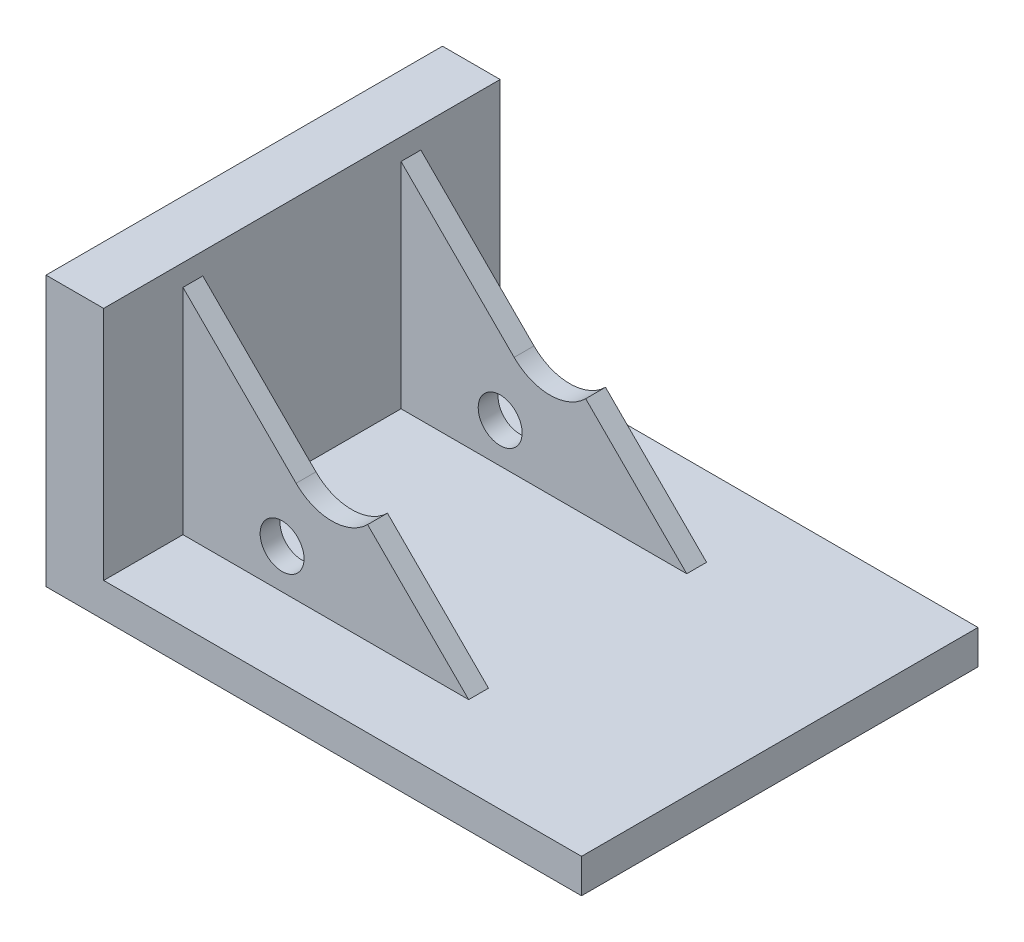
ISO-10303-21;
HEADER;
FILE_DESCRIPTION(('STEP AP214'),'2;1');
FILE_NAME('part.step','',(''),(''),'','','');
FILE_SCHEMA(('AUTOMOTIVE_DESIGN { 1 0 10303 214 1 1 1 1 }'));
ENDSEC;
DATA;
#1=APPLICATION_CONTEXT('core data for automotive mechanical design processes');
#2=APPLICATION_PROTOCOL_DEFINITION('international standard','automotive_design',2000,#1);
#3=PRODUCT_CONTEXT('',#1,'mechanical');
#4=PRODUCT('Part','Part','',(#3));
#5=PRODUCT_RELATED_PRODUCT_CATEGORY('part','',(#4));
#6=PRODUCT_DEFINITION_FORMATION('','',#4);
#7=PRODUCT_DEFINITION_CONTEXT('part definition',#1,'design');
#8=PRODUCT_DEFINITION('design','',#6,#7);
#9=PRODUCT_DEFINITION_SHAPE('','',#8);
#10=(LENGTH_UNIT() NAMED_UNIT(*) SI_UNIT(.MILLI.,.METRE.));
#11=(NAMED_UNIT(*) PLANE_ANGLE_UNIT() SI_UNIT($,.RADIAN.));
#12=(NAMED_UNIT(*) SI_UNIT($,.STERADIAN.) SOLID_ANGLE_UNIT());
#13=UNCERTAINTY_MEASURE_WITH_UNIT(LENGTH_MEASURE(1.E-05),#10,'distance_accuracy_value','');
#14=(GEOMETRIC_REPRESENTATION_CONTEXT(3) GLOBAL_UNCERTAINTY_ASSIGNED_CONTEXT((#13)) GLOBAL_UNIT_ASSIGNED_CONTEXT((#10,
#11,#12)) REPRESENTATION_CONTEXT('',''));
#15=CARTESIAN_POINT('',(0.,0.,0.));
#16=DIRECTION('',(0.,0.,1.));
#17=DIRECTION('',(1.,0.,0.));
#18=AXIS2_PLACEMENT_3D('',#15,#16,#17);
#19=CARTESIAN_POINT('',(-67.3265667328878,68.0538598920394,50.));
#20=DIRECTION('',(1.,0.,0.));
#21=DIRECTION('',(0.,0.,-1.));
#22=AXIS2_PLACEMENT_3D('',#19,#20,#21);
#23=PLANE('',#22);
#24=DIRECTION('',(0.,-1.,0.));
#25=VECTOR('',#24,1.);
#26=CARTESIAN_POINT('',(-67.3265667328878,68.0538598920394,-50.));
#27=LINE('',#26,#25);
#28=CARTESIAN_POINT('',(-67.3265667328878,68.0538598920394,-50.));
#29=VERTEX_POINT('',#28);
#30=CARTESIAN_POINT('',(-67.3265667328878,0.,-50.));
#31=VERTEX_POINT('',#30);
#32=EDGE_CURVE('E225',#29,#31,#27,.T.);
#33=ORIENTED_EDGE('',*,*,#32,.T.);
#34=DIRECTION('',(0.,0.,-1.));
#35=VECTOR('',#34,1.);
#36=CARTESIAN_POINT('',(-67.3265667328878,0.,50.));
#37=LINE('',#36,#35);
#38=CARTESIAN_POINT('',(-67.3265667328878,0.,50.));
#39=VERTEX_POINT('',#38);
#40=EDGE_CURVE('E269',#39,#31,#37,.T.);
#41=ORIENTED_EDGE('',*,*,#40,.F.);
#42=DIRECTION('',(0.,-1.,0.));
#43=VECTOR('',#42,1.);
#44=CARTESIAN_POINT('',(-67.3265667328878,68.0538598920394,50.));
#45=LINE('',#44,#43);
#46=CARTESIAN_POINT('',(-67.3265667328878,68.0538598920394,50.));
#47=VERTEX_POINT('',#46);
#48=EDGE_CURVE('E226',#47,#39,#45,.T.);
#49=ORIENTED_EDGE('',*,*,#48,.F.);
#50=DIRECTION('',(0.,0.,-1.));
#51=VECTOR('',#50,1.);
#52=CARTESIAN_POINT('',(-67.3265667328878,68.0538598920394,50.));
#53=LINE('',#52,#51);
#54=EDGE_CURVE('E240',#47,#29,#53,.T.);
#55=ORIENTED_EDGE('',*,*,#54,.T.);
#56=EDGE_LOOP('',(#33,#41,#49,#55));
#57=FACE_BOUND('',#56,.T.);
#58=ADVANCED_FACE('F37',(#57),#23,.F.);
#59=CARTESIAN_POINT('',(-67.3265667328878,0.,50.));
#60=DIRECTION('',(0.,1.,0.));
#61=DIRECTION('',(0.,0.,1.));
#62=AXIS2_PLACEMENT_3D('',#59,#60,#61);
#63=PLANE('',#62);
#64=ORIENTED_EDGE('',*,*,#40,.T.);
#65=DIRECTION('',(1.,0.,0.));
#66=VECTOR('',#65,1.);
#67=CARTESIAN_POINT('',(-67.3265667328878,0.,-50.));
#68=LINE('',#67,#66);
#69=CARTESIAN_POINT('',(67.7421628238316,0.,-50.));
#70=VERTEX_POINT('',#69);
#71=EDGE_CURVE('E243',#31,#70,#68,.T.);
#72=ORIENTED_EDGE('',*,*,#71,.T.);
#73=DIRECTION('',(0.,0.,-1.));
#74=VECTOR('',#73,1.);
#75=CARTESIAN_POINT('',(67.7421628238316,0.,50.));
#76=LINE('',#75,#74);
#77=CARTESIAN_POINT('',(67.7421628238316,0.,50.));
#78=VERTEX_POINT('',#77);
#79=EDGE_CURVE('E266',#78,#70,#76,.T.);
#80=ORIENTED_EDGE('',*,*,#79,.F.);
#81=DIRECTION('',(1.,0.,0.));
#82=VECTOR('',#81,1.);
#83=CARTESIAN_POINT('',(-67.3265667328878,0.,50.));
#84=LINE('',#83,#82);
#85=EDGE_CURVE('E229',#39,#78,#84,.T.);
#86=ORIENTED_EDGE('',*,*,#85,.F.);
#87=EDGE_LOOP('',(#64,#72,#80,#86));
#88=FACE_BOUND('',#87,.T.);
#89=ADVANCED_FACE('F334',(#88),#63,.F.);
#90=CARTESIAN_POINT('',(67.7421628238316,0.,50.));
#91=DIRECTION('',(-1.,0.,0.));
#92=DIRECTION('',(0.,0.,1.));
#93=AXIS2_PLACEMENT_3D('',#90,#91,#92);
#94=PLANE('',#93);
#95=DIRECTION('',(0.,1.,0.));
#96=VECTOR('',#95,1.);
#97=CARTESIAN_POINT('',(67.7421628238316,0.,-50.));
#98=LINE('',#97,#96);
#99=CARTESIAN_POINT('',(67.7421628238316,8.62361888708285,-50.));
#100=VERTEX_POINT('',#99);
#101=EDGE_CURVE('E245',#70,#100,#98,.T.);
#102=ORIENTED_EDGE('',*,*,#101,.T.);
#103=DIRECTION('',(0.,0.,-1.));
#104=VECTOR('',#103,1.);
#105=CARTESIAN_POINT('',(67.7421628238316,8.62361888708285,50.));
#106=LINE('',#105,#104);
#107=CARTESIAN_POINT('',(67.7421628238316,8.62361888708285,50.));
#108=VERTEX_POINT('',#107);
#109=EDGE_CURVE('E262',#108,#100,#106,.T.);
#110=ORIENTED_EDGE('',*,*,#109,.F.);
#111=DIRECTION('',(0.,1.,0.));
#112=VECTOR('',#111,1.);
#113=CARTESIAN_POINT('',(67.7421628238316,0.,50.));
#114=LINE('',#113,#112);
#115=EDGE_CURVE('E232',#78,#108,#114,.T.);
#116=ORIENTED_EDGE('',*,*,#115,.F.);
#117=ORIENTED_EDGE('',*,*,#79,.T.);
#118=EDGE_LOOP('',(#102,#110,#116,#117));
#119=FACE_BOUND('',#118,.T.);
#120=ADVANCED_FACE('F306',(#119),#94,.F.);
#121=CARTESIAN_POINT('',(67.7421628238316,8.62361888708285,50.));
#122=DIRECTION('',(0.,-1.,0.));
#123=DIRECTION('',(0.,0.,-1.));
#124=AXIS2_PLACEMENT_3D('',#121,#122,#123);
#125=PLANE('',#124);
#126=DIRECTION('',(0.,0.,-1.));
#127=VECTOR('',#126,1.);
#128=CARTESIAN_POINT('',(-52.7807035498565,8.62361888708285,50.));
#129=LINE('',#128,#127);
#130=CARTESIAN_POINT('',(-52.7807035498565,8.62361888708285,-30.));
#131=VERTEX_POINT('',#130);
#132=CARTESIAN_POINT('',(-52.7807035498565,8.62361888708285,-50.));
#133=VERTEX_POINT('',#132);
#134=EDGE_CURVE('E258',#131,#133,#129,.T.);
#135=ORIENTED_EDGE('',*,*,#134,.F.);
#136=DIRECTION('',(1.,0.,0.));
#137=VECTOR('',#136,1.);
#138=CARTESIAN_POINT('',(67.7421628238316,8.62361888708285,-30.));
#139=LINE('',#138,#137);
#140=CARTESIAN_POINT('',(19.2795506542954,8.62361888708285,-30.));
#141=VERTEX_POINT('',#140);
#142=EDGE_CURVE('E50',#131,#141,#139,.T.);
#143=ORIENTED_EDGE('',*,*,#142,.T.);
#144=DIRECTION('',(0.,0.,1.));
#145=VECTOR('',#144,1.);
#146=CARTESIAN_POINT('',(19.2795506542954,8.62361888708285,50.));
#147=LINE('',#146,#145);
#148=CARTESIAN_POINT('',(19.2795506542954,8.62361888708285,-25.));
#149=VERTEX_POINT('',#148);
#150=EDGE_CURVE('E11',#141,#149,#147,.T.);
#151=ORIENTED_EDGE('',*,*,#150,.T.);
#152=DIRECTION('',(1.,0.,0.));
#153=VECTOR('',#152,1.);
#154=CARTESIAN_POINT('',(67.7421628238316,8.62361888708285,-25.));
#155=LINE('',#154,#153);
#156=CARTESIAN_POINT('',(-52.7807035498565,8.62361888708285,-25.));
#157=VERTEX_POINT('',#156);
#158=EDGE_CURVE('E185',#157,#149,#155,.T.);
#159=ORIENTED_EDGE('',*,*,#158,.F.);
#160=CARTESIAN_POINT('',(-52.7807035498565,8.62361888708285,25.));
#161=VERTEX_POINT('',#160);
#162=EDGE_CURVE('E263',#161,#157,#129,.T.);
#163=ORIENTED_EDGE('',*,*,#162,.F.);
#164=DIRECTION('',(-1.,0.,0.));
#165=VECTOR('',#164,1.);
#166=CARTESIAN_POINT('',(67.7421628238316,8.62361888708285,25.));
#167=LINE('',#166,#165);
#168=CARTESIAN_POINT('',(19.2795506542954,8.62361888708285,25.));
#169=VERTEX_POINT('',#168);
#170=EDGE_CURVE('E216',#169,#161,#167,.T.);
#171=ORIENTED_EDGE('',*,*,#170,.F.);
#172=DIRECTION('',(0.,0.,-1.));
#173=VECTOR('',#172,1.);
#174=CARTESIAN_POINT('',(19.2795506542954,8.62361888708285,50.));
#175=LINE('',#174,#173);
#176=CARTESIAN_POINT('',(19.2795506542954,8.62361888708285,30.));
#177=VERTEX_POINT('',#176);
#178=EDGE_CURVE('E44',#169,#177,#175,.F.);
#179=ORIENTED_EDGE('',*,*,#178,.T.);
#180=DIRECTION('',(-1.,0.,0.));
#181=VECTOR('',#180,1.);
#182=CARTESIAN_POINT('',(67.7421628238316,8.62361888708285,30.));
#183=LINE('',#182,#181);
#184=CARTESIAN_POINT('',(-52.7807035498565,8.62361888708285,30.));
#185=VERTEX_POINT('',#184);
#186=EDGE_CURVE('E221',#177,#185,#183,.T.);
#187=ORIENTED_EDGE('',*,*,#186,.T.);
#188=CARTESIAN_POINT('',(-52.7807035498565,8.62361888708285,50.));
#189=VERTEX_POINT('',#188);
#190=EDGE_CURVE('E259',#189,#185,#129,.T.);
#191=ORIENTED_EDGE('',*,*,#190,.F.);
#192=DIRECTION('',(-1.,0.,0.));
#193=VECTOR('',#192,1.);
#194=CARTESIAN_POINT('',(67.7421628238316,8.62361888708285,50.));
#195=LINE('',#194,#193);
#196=EDGE_CURVE('E234',#108,#189,#195,.T.);
#197=ORIENTED_EDGE('',*,*,#196,.F.);
#198=ORIENTED_EDGE('',*,*,#109,.T.);
#199=DIRECTION('',(-1.,0.,0.));
#200=VECTOR('',#199,1.);
#201=CARTESIAN_POINT('',(67.7421628238316,8.62361888708285,-50.));
#202=LINE('',#201,#200);
#203=EDGE_CURVE('E247',#100,#133,#202,.T.);
#204=ORIENTED_EDGE('',*,*,#203,.T.);
#205=EDGE_LOOP('',(#135,#143,#151,#159,#163,#171,#179,#187,#191,#197,#198,#204));
#206=FACE_BOUND('',#205,.T.);
#207=ADVANCED_FACE('F272',(#206),#125,.F.);
#208=CARTESIAN_POINT('',(-52.7807035498565,8.62361888708285,50.));
#209=DIRECTION('',(-1.,0.,0.));
#210=DIRECTION('',(0.,0.,1.));
#211=AXIS2_PLACEMENT_3D('',#208,#209,#210);
#212=PLANE('',#211);
#213=DIRECTION('',(0.,0.,-1.));
#214=VECTOR('',#213,1.);
#215=CARTESIAN_POINT('',(-52.7807035498565,62.6432681922818,50.));
#216=LINE('',#215,#214);
#217=CARTESIAN_POINT('',(-52.7807035498565,62.6432681922818,-25.));
#218=VERTEX_POINT('',#217);
#219=CARTESIAN_POINT('',(-52.7807035498565,62.6432681922818,-30.));
#220=VERTEX_POINT('',#219);
#221=EDGE_CURVE('E190',#218,#220,#216,.T.);
#222=ORIENTED_EDGE('',*,*,#221,.T.);
#223=DIRECTION('',(0.,-1.,0.));
#224=VECTOR('',#223,1.);
#225=CARTESIAN_POINT('',(-52.7807035498565,8.62361888708285,-30.));
#226=LINE('',#225,#224);
#227=EDGE_CURVE('E187',#220,#131,#226,.T.);
#228=ORIENTED_EDGE('',*,*,#227,.T.);
#229=ORIENTED_EDGE('',*,*,#134,.T.);
#230=DIRECTION('',(0.,1.,0.));
#231=VECTOR('',#230,1.);
#232=CARTESIAN_POINT('',(-52.7807035498565,8.62361888708285,-50.));
#233=LINE('',#232,#231);
#234=CARTESIAN_POINT('',(-52.7807035498565,68.0538598920394,-50.));
#235=VERTEX_POINT('',#234);
#236=EDGE_CURVE('E250',#133,#235,#233,.T.);
#237=ORIENTED_EDGE('',*,*,#236,.T.);
#238=DIRECTION('',(0.,0.,-1.));
#239=VECTOR('',#238,1.);
#240=CARTESIAN_POINT('',(-52.7807035498565,68.0538598920394,50.));
#241=LINE('',#240,#239);
#242=CARTESIAN_POINT('',(-52.7807035498565,68.0538598920394,50.));
#243=VERTEX_POINT('',#242);
#244=EDGE_CURVE('E255',#243,#235,#241,.T.);
#245=ORIENTED_EDGE('',*,*,#244,.F.);
#246=DIRECTION('',(0.,1.,0.));
#247=VECTOR('',#246,1.);
#248=CARTESIAN_POINT('',(-52.7807035498565,8.62361888708285,50.));
#249=LINE('',#248,#247);
#250=EDGE_CURVE('E236',#189,#243,#249,.T.);
#251=ORIENTED_EDGE('',*,*,#250,.F.);
#252=ORIENTED_EDGE('',*,*,#190,.T.);
#253=DIRECTION('',(0.,1.,0.));
#254=VECTOR('',#253,1.);
#255=CARTESIAN_POINT('',(-52.7807035498565,8.62361888708285,30.));
#256=LINE('',#255,#254);
#257=CARTESIAN_POINT('',(-52.7807035498565,62.6432681922818,30.));
#258=VERTEX_POINT('',#257);
#259=EDGE_CURVE('E219',#185,#258,#256,.T.);
#260=ORIENTED_EDGE('',*,*,#259,.T.);
#261=DIRECTION('',(0.,0.,1.));
#262=VECTOR('',#261,1.);
#263=CARTESIAN_POINT('',(-52.7807035498565,62.6432681922818,50.));
#264=LINE('',#263,#262);
#265=CARTESIAN_POINT('',(-52.7807035498565,62.6432681922818,25.));
#266=VERTEX_POINT('',#265);
#267=EDGE_CURVE('E223',#258,#266,#264,.F.);
#268=ORIENTED_EDGE('',*,*,#267,.T.);
#269=DIRECTION('',(0.,1.,0.));
#270=VECTOR('',#269,1.);
#271=CARTESIAN_POINT('',(-52.7807035498565,8.62361888708285,25.));
#272=LINE('',#271,#270);
#273=EDGE_CURVE('E213',#161,#266,#272,.T.);
#274=ORIENTED_EDGE('',*,*,#273,.F.);
#275=ORIENTED_EDGE('',*,*,#162,.T.);
#276=DIRECTION('',(0.,-1.,0.));
#277=VECTOR('',#276,1.);
#278=CARTESIAN_POINT('',(-52.7807035498565,8.62361888708285,-25.));
#279=LINE('',#278,#277);
#280=EDGE_CURVE('E182',#218,#157,#279,.T.);
#281=ORIENTED_EDGE('',*,*,#280,.F.);
#282=EDGE_LOOP('',(#222,#228,#229,#237,#245,#251,#252,#260,#268,#274,#275,#281));
#283=FACE_BOUND('',#282,.T.);
#284=ADVANCED_FACE('F295',(#283),#212,.F.);
#285=CARTESIAN_POINT('',(-52.7807035498565,68.0538598920394,50.));
#286=DIRECTION('',(0.,-1.,0.));
#287=DIRECTION('',(0.,0.,-1.));
#288=AXIS2_PLACEMENT_3D('',#285,#286,#287);
#289=PLANE('',#288);
#290=DIRECTION('',(-1.,0.,0.));
#291=VECTOR('',#290,1.);
#292=CARTESIAN_POINT('',(-52.7807035498565,68.0538598920394,-50.));
#293=LINE('',#292,#291);
#294=EDGE_CURVE('E230',#235,#29,#293,.T.);
#295=ORIENTED_EDGE('',*,*,#294,.T.);
#296=ORIENTED_EDGE('',*,*,#54,.F.);
#297=DIRECTION('',(-1.,0.,0.));
#298=VECTOR('',#297,1.);
#299=CARTESIAN_POINT('',(-52.7807035498565,68.0538598920394,50.));
#300=LINE('',#299,#298);
#301=EDGE_CURVE('E238',#243,#47,#300,.T.);
#302=ORIENTED_EDGE('',*,*,#301,.F.);
#303=ORIENTED_EDGE('',*,*,#244,.T.);
#304=EDGE_LOOP('',(#295,#296,#302,#303));
#305=FACE_BOUND('',#304,.T.);
#306=ADVANCED_FACE('F344',(#305),#289,.F.);
#307=CARTESIAN_POINT('',(0.,0.,50.));
#308=DIRECTION('',(0.,0.,1.));
#309=DIRECTION('',(1.,0.,0.));
#310=AXIS2_PLACEMENT_3D('',#307,#308,#309);
#311=PLANE('',#310);
#312=ORIENTED_EDGE('',*,*,#48,.T.);
#313=ORIENTED_EDGE('',*,*,#85,.T.);
#314=ORIENTED_EDGE('',*,*,#115,.T.);
#315=ORIENTED_EDGE('',*,*,#196,.T.);
#316=ORIENTED_EDGE('',*,*,#250,.T.);
#317=ORIENTED_EDGE('',*,*,#301,.T.);
#318=EDGE_LOOP('',(#312,#313,#314,#315,#316,#317));
#319=FACE_BOUND('',#318,.T.);
#320=ADVANCED_FACE('F302',(#319),#311,.T.);
#321=CARTESIAN_POINT('',(0.,0.,-50.));
#322=DIRECTION('',(0.,0.,1.));
#323=DIRECTION('',(1.,0.,0.));
#324=AXIS2_PLACEMENT_3D('',#321,#322,#323);
#325=PLANE('',#324);
#326=ORIENTED_EDGE('',*,*,#32,.F.);
#327=ORIENTED_EDGE('',*,*,#294,.F.);
#328=ORIENTED_EDGE('',*,*,#236,.F.);
#329=ORIENTED_EDGE('',*,*,#203,.F.);
#330=ORIENTED_EDGE('',*,*,#101,.F.);
#331=ORIENTED_EDGE('',*,*,#71,.F.);
#332=EDGE_LOOP('',(#326,#327,#328,#329,#330,#331));
#333=FACE_BOUND('',#332,.T.);
#334=ADVANCED_FACE('F311',(#333),#325,.F.);
#335=CARTESIAN_POINT('',(-6.21049408204075,34.1136636234187,30.));
#336=DIRECTION('',(-0.707106781186542,-0.707106781186553,0.));
#337=DIRECTION('',(0.707106781186553,-0.707106781186542,0.));
#338=AXIS2_PLACEMENT_3D('',#335,#336,#337);
#339=PLANE('',#338);
#340=ORIENTED_EDGE('',*,*,#178,.F.);
#341=DIRECTION('',(0.707106781186553,-0.707106781186542,0.));
#342=VECTOR('',#341,1.);
#343=CARTESIAN_POINT('',(-6.21049408204075,34.1136636234187,25.));
#344=LINE('',#343,#342);
#345=CARTESIAN_POINT('',(-6.21049408204074,34.1136636234187,25.));
#346=VERTEX_POINT('',#345);
#347=EDGE_CURVE('E192',#346,#169,#344,.T.);
#348=ORIENTED_EDGE('',*,*,#347,.F.);
#349=DIRECTION('',(0.,0.,1.));
#350=VECTOR('',#349,1.);
#351=CARTESIAN_POINT('',(-6.21049408204074,34.1136636234187,30.));
#352=LINE('',#351,#350);
#353=CARTESIAN_POINT('',(-6.21049408204074,34.1136636234187,30.));
#354=VERTEX_POINT('',#353);
#355=EDGE_CURVE('E211',#346,#354,#352,.T.);
#356=ORIENTED_EDGE('',*,*,#355,.T.);
#357=DIRECTION('',(0.707106781186553,-0.707106781186542,0.));
#358=VECTOR('',#357,1.);
#359=CARTESIAN_POINT('',(-6.21049408204075,34.1136636234187,30.));
#360=LINE('',#359,#358);
#361=EDGE_CURVE('E193',#354,#177,#360,.T.);
#362=ORIENTED_EDGE('',*,*,#361,.T.);
#363=EDGE_LOOP('',(#340,#348,#356,#362));
#364=FACE_BOUND('',#363,.T.);
#365=ADVANCED_FACE('F283',(#364),#339,.F.);
#366=CARTESIAN_POINT('',(-45.2406489115058,55.1032135539313,30.));
#367=DIRECTION('',(-0.707106781186539,-0.707106781186556,0.));
#368=DIRECTION('',(0.707106781186556,-0.707106781186539,0.));
#369=AXIS2_PLACEMENT_3D('',#366,#367,#368);
#370=PLANE('',#369);
#371=ORIENTED_EDGE('',*,*,#267,.F.);
#372=DIRECTION('',(0.707106781186556,-0.707106781186539,0.));
#373=VECTOR('',#372,1.);
#374=CARTESIAN_POINT('',(-45.2406489115058,55.1032135539313,30.));
#375=LINE('',#374,#373);
#376=CARTESIAN_POINT('',(-24.2510989809929,34.113663623419,30.));
#377=VERTEX_POINT('',#376);
#378=EDGE_CURVE('E200',#258,#377,#375,.T.);
#379=ORIENTED_EDGE('',*,*,#378,.T.);
#380=DIRECTION('',(0.,0.,1.));
#381=VECTOR('',#380,1.);
#382=CARTESIAN_POINT('',(-24.2510989809929,34.113663623419,30.));
#383=LINE('',#382,#381);
#384=CARTESIAN_POINT('',(-24.2510989809929,34.113663623419,25.));
#385=VERTEX_POINT('',#384);
#386=EDGE_CURVE('E202',#385,#377,#383,.T.);
#387=ORIENTED_EDGE('',*,*,#386,.F.);
#388=DIRECTION('',(0.707106781186556,-0.707106781186539,0.));
#389=VECTOR('',#388,1.);
#390=CARTESIAN_POINT('',(-45.2406489115058,55.1032135539313,25.));
#391=LINE('',#390,#389);
#392=EDGE_CURVE('E197',#266,#385,#391,.T.);
#393=ORIENTED_EDGE('',*,*,#392,.F.);
#394=EDGE_LOOP('',(#371,#379,#387,#393));
#395=FACE_BOUND('',#394,.T.);
#396=ADVANCED_FACE('F293',(#395),#370,.F.);
#397=CARTESIAN_POINT('',(0.207798045471885,34.0269299460197,30.));
#398=DIRECTION('',(0.,0.,1.));
#399=DIRECTION('',(1.,0.,0.));
#400=AXIS2_PLACEMENT_3D('',#397,#398,#399);
#401=PLANE('',#400);
#402=CARTESIAN_POINT('',(-27.7807035498565,18.6236188870829,30.));
#403=DIRECTION('',(0.,0.,1.));
#404=DIRECTION('',(1.,0.,0.));
#405=AXIS2_PLACEMENT_3D('',#402,#403,#404);
#406=CIRCLE('',#405,5.53719999999999);
#407=CARTESIAN_POINT('',(-22.2435035498565,18.6236188870829,30.));
#408=VERTEX_POINT('',#407);
#409=EDGE_CURVE('E455',#408,#408,#406,.T.);
#410=ORIENTED_EDGE('',*,*,#409,.F.);
#411=EDGE_LOOP('',(#410));
#412=FACE_BOUND('',#411,.T.);
#413=ORIENTED_EDGE('',*,*,#186,.F.);
#414=ORIENTED_EDGE('',*,*,#361,.F.);
#415=CARTESIAN_POINT('',(-15.2307965315167,43.1339660728954,30.));
#416=DIRECTION('',(0.,0.,1.));
#417=DIRECTION('',(1.,0.,0.));
#418=AXIS2_PLACEMENT_3D('',#415,#416,#417);
#419=CIRCLE('',#418,12.7566340607567);
#420=EDGE_CURVE('E196',#377,#354,#419,.T.);
#421=ORIENTED_EDGE('',*,*,#420,.F.);
#422=ORIENTED_EDGE('',*,*,#378,.F.);
#423=ORIENTED_EDGE('',*,*,#259,.F.);
#424=EDGE_LOOP('',(#413,#414,#421,#422,#423));
#425=FACE_BOUND('',#424,.T.);
#426=ADVANCED_FACE('F280',(#412,#425),#401,.T.);
#427=CARTESIAN_POINT('',(0.207798045471885,34.0269299460197,25.));
#428=DIRECTION('',(0.,0.,1.));
#429=DIRECTION('',(1.,0.,0.));
#430=AXIS2_PLACEMENT_3D('',#427,#428,#429);
#431=PLANE('',#430);
#432=CARTESIAN_POINT('',(-27.7807035498565,18.6236188870829,25.));
#433=DIRECTION('',(0.,0.,1.));
#434=DIRECTION('',(1.,0.,0.));
#435=AXIS2_PLACEMENT_3D('',#432,#433,#434);
#436=CIRCLE('',#435,5.53719999999999);
#437=CARTESIAN_POINT('',(-22.2435035498565,18.6236188870829,25.));
#438=VERTEX_POINT('',#437);
#439=EDGE_CURVE('E174',#438,#438,#436,.T.);
#440=ORIENTED_EDGE('',*,*,#439,.T.);
#441=EDGE_LOOP('',(#440));
#442=FACE_BOUND('',#441,.T.);
#443=ORIENTED_EDGE('',*,*,#347,.T.);
#444=ORIENTED_EDGE('',*,*,#170,.T.);
#445=ORIENTED_EDGE('',*,*,#273,.T.);
#446=ORIENTED_EDGE('',*,*,#392,.T.);
#447=CARTESIAN_POINT('',(-15.2307965315167,43.1339660728954,25.));
#448=DIRECTION('',(0.,0.,1.));
#449=DIRECTION('',(1.,0.,0.));
#450=AXIS2_PLACEMENT_3D('',#447,#448,#449);
#451=CIRCLE('',#450,12.7566340607567);
#452=EDGE_CURVE('E204',#385,#346,#451,.T.);
#453=ORIENTED_EDGE('',*,*,#452,.T.);
#454=EDGE_LOOP('',(#443,#444,#445,#446,#453));
#455=FACE_BOUND('',#454,.T.);
#456=ADVANCED_FACE('F288',(#442,#455),#431,.F.);
#457=CARTESIAN_POINT('',(-15.2307965315167,43.1339660728954,30.));
#458=DIRECTION('',(0.,0.,1.));
#459=DIRECTION('',(1.,0.,0.));
#460=AXIS2_PLACEMENT_3D('',#457,#458,#459);
#461=CYLINDRICAL_SURFACE('',#460,12.7566340607567);
#462=ORIENTED_EDGE('',*,*,#355,.F.);
#463=ORIENTED_EDGE('',*,*,#452,.F.);
#464=ORIENTED_EDGE('',*,*,#386,.T.);
#465=ORIENTED_EDGE('',*,*,#420,.T.);
#466=EDGE_LOOP('',(#462,#463,#464,#465));
#467=FACE_BOUND('',#466,.T.);
#468=ADVANCED_FACE('F286',(#467),#461,.F.);
#469=CARTESIAN_POINT('',(-6.21049408204075,34.1136636234187,-30.));
#470=DIRECTION('',(0.707106781186542,0.707106781186553,0.));
#471=DIRECTION('',(0.707106781186553,-0.707106781186542,0.));
#472=AXIS2_PLACEMENT_3D('',#469,#470,#471);
#473=PLANE('',#472);
#474=ORIENTED_EDGE('',*,*,#150,.F.);
#475=DIRECTION('',(0.707106781186553,-0.707106781186542,0.));
#476=VECTOR('',#475,1.);
#477=CARTESIAN_POINT('',(-6.21049408204075,34.1136636234187,-30.));
#478=LINE('',#477,#476);
#479=CARTESIAN_POINT('',(-6.21049408204074,34.1136636234187,-30.));
#480=VERTEX_POINT('',#479);
#481=EDGE_CURVE('E164',#480,#141,#478,.T.);
#482=ORIENTED_EDGE('',*,*,#481,.F.);
#483=DIRECTION('',(0.,0.,-1.));
#484=VECTOR('',#483,1.);
#485=CARTESIAN_POINT('',(-6.21049408204074,34.1136636234187,-30.));
#486=LINE('',#485,#484);
#487=CARTESIAN_POINT('',(-6.21049408204074,34.1136636234187,-25.));
#488=VERTEX_POINT('',#487);
#489=EDGE_CURVE('E147',#488,#480,#486,.T.);
#490=ORIENTED_EDGE('',*,*,#489,.F.);
#491=DIRECTION('',(0.707106781186553,-0.707106781186542,0.));
#492=VECTOR('',#491,1.);
#493=CARTESIAN_POINT('',(-6.21049408204075,34.1136636234187,-25.));
#494=LINE('',#493,#492);
#495=EDGE_CURVE('E178',#488,#149,#494,.T.);
#496=ORIENTED_EDGE('',*,*,#495,.T.);
#497=EDGE_LOOP('',(#474,#482,#490,#496));
#498=FACE_BOUND('',#497,.T.);
#499=ADVANCED_FACE('F169',(#498),#473,.T.);
#500=CARTESIAN_POINT('',(-45.2406489115058,55.1032135539313,-30.));
#501=DIRECTION('',(0.707106781186539,0.707106781186556,0.));
#502=DIRECTION('',(0.707106781186556,-0.707106781186539,0.));
#503=AXIS2_PLACEMENT_3D('',#500,#501,#502);
#504=PLANE('',#503);
#505=ORIENTED_EDGE('',*,*,#221,.F.);
#506=DIRECTION('',(0.707106781186556,-0.707106781186539,0.));
#507=VECTOR('',#506,1.);
#508=CARTESIAN_POINT('',(-45.2406489115058,55.1032135539313,-25.));
#509=LINE('',#508,#507);
#510=CARTESIAN_POINT('',(-24.2510989809929,34.113663623419,-25.));
#511=VERTEX_POINT('',#510);
#512=EDGE_CURVE('E170',#218,#511,#509,.T.);
#513=ORIENTED_EDGE('',*,*,#512,.T.);
#514=DIRECTION('',(0.,0.,-1.));
#515=VECTOR('',#514,1.);
#516=CARTESIAN_POINT('',(-24.2510989809929,34.113663623419,-30.));
#517=LINE('',#516,#515);
#518=CARTESIAN_POINT('',(-24.2510989809929,34.113663623419,-30.));
#519=VERTEX_POINT('',#518);
#520=EDGE_CURVE('E158',#511,#519,#517,.T.);
#521=ORIENTED_EDGE('',*,*,#520,.T.);
#522=DIRECTION('',(0.707106781186556,-0.707106781186539,0.));
#523=VECTOR('',#522,1.);
#524=CARTESIAN_POINT('',(-45.2406489115058,55.1032135539313,-30.));
#525=LINE('',#524,#523);
#526=EDGE_CURVE('E159',#220,#519,#525,.T.);
#527=ORIENTED_EDGE('',*,*,#526,.F.);
#528=EDGE_LOOP('',(#505,#513,#521,#527));
#529=FACE_BOUND('',#528,.T.);
#530=ADVANCED_FACE('F316',(#529),#504,.T.);
#531=CARTESIAN_POINT('',(0.207798045471885,34.0269299460197,-30.));
#532=DIRECTION('',(0.,0.,-1.));
#533=DIRECTION('',(-1.,0.,0.));
#534=AXIS2_PLACEMENT_3D('',#531,#532,#533);
#535=PLANE('',#534);
#536=CARTESIAN_POINT('',(-27.7807035498565,18.6236188870829,-30.));
#537=DIRECTION('',(0.,0.,-1.));
#538=DIRECTION('',(-1.,0.,0.));
#539=AXIS2_PLACEMENT_3D('',#536,#537,#538);
#540=CIRCLE('',#539,5.5372);
#541=CARTESIAN_POINT('',(-33.3179035498565,18.6236188870829,-30.));
#542=VERTEX_POINT('',#541);
#543=EDGE_CURVE('E459',#542,#542,#540,.T.);
#544=ORIENTED_EDGE('',*,*,#543,.F.);
#545=EDGE_LOOP('',(#544));
#546=FACE_BOUND('',#545,.T.);
#547=ORIENTED_EDGE('',*,*,#142,.F.);
#548=ORIENTED_EDGE('',*,*,#227,.F.);
#549=ORIENTED_EDGE('',*,*,#526,.T.);
#550=CARTESIAN_POINT('',(-15.2307965315167,43.1339660728954,-30.));
#551=DIRECTION('',(0.,0.,1.));
#552=DIRECTION('',(1.,0.,0.));
#553=AXIS2_PLACEMENT_3D('',#550,#551,#552);
#554=CIRCLE('',#553,12.7566340607567);
#555=EDGE_CURVE('E151',#519,#480,#554,.T.);
#556=ORIENTED_EDGE('',*,*,#555,.T.);
#557=ORIENTED_EDGE('',*,*,#481,.T.);
#558=EDGE_LOOP('',(#547,#548,#549,#556,#557));
#559=FACE_BOUND('',#558,.T.);
#560=ADVANCED_FACE('F163',(#546,#559),#535,.T.);
#561=CARTESIAN_POINT('',(0.207798045471885,34.0269299460197,-25.));
#562=DIRECTION('',(0.,0.,-1.));
#563=DIRECTION('',(-1.,0.,0.));
#564=AXIS2_PLACEMENT_3D('',#561,#562,#563);
#565=PLANE('',#564);
#566=CARTESIAN_POINT('',(-27.7807035498565,18.6236188870829,-25.));
#567=DIRECTION('',(0.,0.,-1.));
#568=DIRECTION('',(-1.,0.,0.));
#569=AXIS2_PLACEMENT_3D('',#566,#567,#568);
#570=CIRCLE('',#569,5.53719999999999);
#571=CARTESIAN_POINT('',(-33.3179035498565,18.6236188870829,-25.));
#572=VERTEX_POINT('',#571);
#573=EDGE_CURVE('E458',#572,#572,#570,.T.);
#574=ORIENTED_EDGE('',*,*,#573,.T.);
#575=EDGE_LOOP('',(#574));
#576=FACE_BOUND('',#575,.T.);
#577=ORIENTED_EDGE('',*,*,#280,.T.);
#578=ORIENTED_EDGE('',*,*,#158,.T.);
#579=ORIENTED_EDGE('',*,*,#495,.F.);
#580=CARTESIAN_POINT('',(-15.2307965315167,43.1339660728954,-25.));
#581=DIRECTION('',(0.,0.,1.));
#582=DIRECTION('',(1.,0.,0.));
#583=AXIS2_PLACEMENT_3D('',#580,#581,#582);
#584=CIRCLE('',#583,12.7566340607567);
#585=EDGE_CURVE('E153',#511,#488,#584,.T.);
#586=ORIENTED_EDGE('',*,*,#585,.F.);
#587=ORIENTED_EDGE('',*,*,#512,.F.);
#588=EDGE_LOOP('',(#577,#578,#579,#586,#587));
#589=FACE_BOUND('',#588,.T.);
#590=ADVANCED_FACE('F319',(#576,#589),#565,.F.);
#591=CARTESIAN_POINT('',(-15.2307965315167,43.1339660728954,-30.));
#592=DIRECTION('',(0.,0.,1.));
#593=DIRECTION('',(1.,0.,0.));
#594=AXIS2_PLACEMENT_3D('',#591,#592,#593);
#595=CYLINDRICAL_SURFACE('',#594,12.7566340607567);
#596=ORIENTED_EDGE('',*,*,#520,.F.);
#597=ORIENTED_EDGE('',*,*,#585,.T.);
#598=ORIENTED_EDGE('',*,*,#489,.T.);
#599=ORIENTED_EDGE('',*,*,#555,.F.);
#600=EDGE_LOOP('',(#596,#597,#598,#599));
#601=FACE_BOUND('',#600,.T.);
#602=ADVANCED_FACE('F150',(#601),#595,.F.);
#603=CARTESIAN_POINT('',(-27.7807035498565,18.6236188870829,-30.));
#604=DIRECTION('',(0.,0.,-1.));
#605=DIRECTION('',(-1.,0.,0.));
#606=AXIS2_PLACEMENT_3D('',#603,#604,#605);
#607=CYLINDRICAL_SURFACE('',#606,5.53719999999999);
#608=ORIENTED_EDGE('',*,*,#543,.T.);
#609=EDGE_LOOP('',(#608));
#610=FACE_BOUND('',#609,.T.);
#611=ORIENTED_EDGE('',*,*,#573,.F.);
#612=EDGE_LOOP('',(#611));
#613=FACE_BOUND('',#612,.T.);
#614=ADVANCED_FACE('F327',(#610,#613),#607,.F.);
#615=ORIENTED_EDGE('',*,*,#409,.T.);
#616=EDGE_LOOP('',(#615));
#617=FACE_BOUND('',#616,.T.);
#618=ORIENTED_EDGE('',*,*,#439,.F.);
#619=EDGE_LOOP('',(#618));
#620=FACE_BOUND('',#619,.T.);
#621=ADVANCED_FACE('F439',(#617,#620),#607,.F.);
#622=CLOSED_SHELL('',(#58,#89,#120,#207,#284,#306,#320,#334,#365,#396,#426,#456,#468,#499,#530,
#560,#590,#602,#614,#621));
#623=MANIFOLD_SOLID_BREP('B2',#622);
#624=ADVANCED_BREP_SHAPE_REPRESENTATION('',(#18,#623),#14);
#625=SHAPE_DEFINITION_REPRESENTATION(#9,#624);
ENDSEC;
END-ISO-10303-21;
